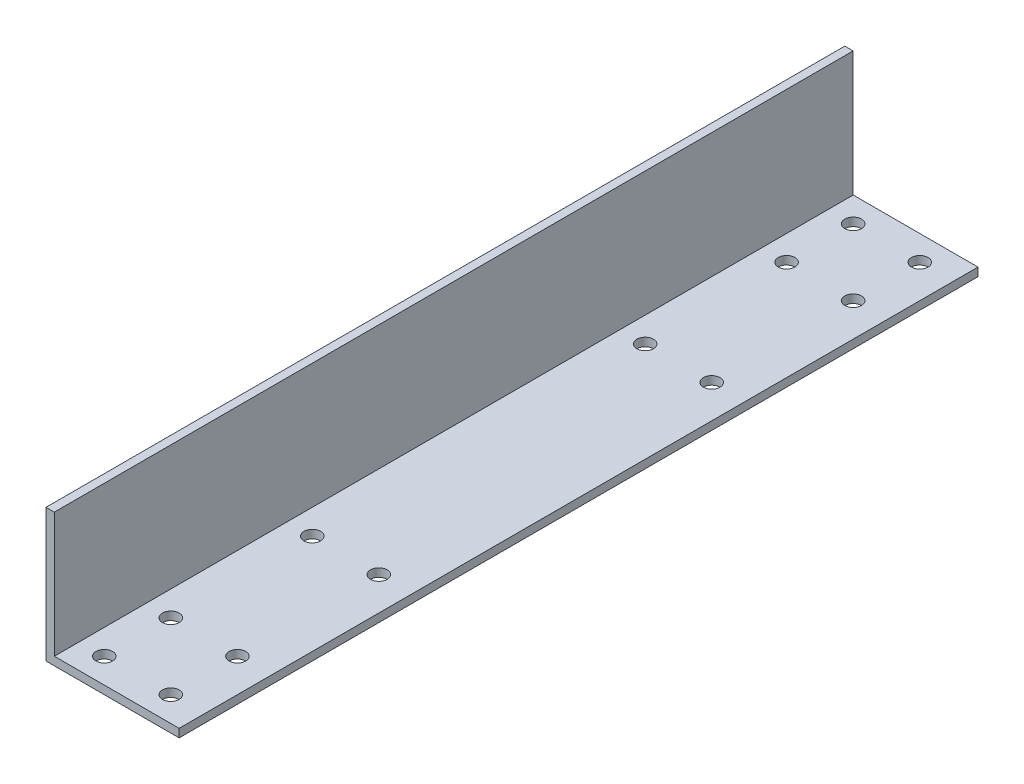
ISO-10303-21;
HEADER;
FILE_DESCRIPTION(('STEP AP214'),'2;1');
FILE_NAME('part.step','',(''),(''),'','','');
FILE_SCHEMA(('AUTOMOTIVE_DESIGN { 1 0 10303 214 1 1 1 1 }'));
ENDSEC;
DATA;
#1=APPLICATION_CONTEXT('core data for automotive mechanical design processes');
#2=APPLICATION_PROTOCOL_DEFINITION('international standard','automotive_design',2000,#1);
#3=PRODUCT_CONTEXT('',#1,'mechanical');
#4=PRODUCT('Part','Part','',(#3));
#5=PRODUCT_RELATED_PRODUCT_CATEGORY('part','',(#4));
#6=PRODUCT_DEFINITION_FORMATION('','',#4);
#7=PRODUCT_DEFINITION_CONTEXT('part definition',#1,'design');
#8=PRODUCT_DEFINITION('design','',#6,#7);
#9=PRODUCT_DEFINITION_SHAPE('','',#8);
#10=(LENGTH_UNIT() NAMED_UNIT(*) SI_UNIT(.MILLI.,.METRE.));
#11=(NAMED_UNIT(*) PLANE_ANGLE_UNIT() SI_UNIT($,.RADIAN.));
#12=(NAMED_UNIT(*) SI_UNIT($,.STERADIAN.) SOLID_ANGLE_UNIT());
#13=UNCERTAINTY_MEASURE_WITH_UNIT(LENGTH_MEASURE(1.E-05),#10,'distance_accuracy_value','');
#14=(GEOMETRIC_REPRESENTATION_CONTEXT(3) GLOBAL_UNCERTAINTY_ASSIGNED_CONTEXT((#13)) GLOBAL_UNIT_ASSIGNED_CONTEXT((#10,
#11,#12)) REPRESENTATION_CONTEXT('',''));
#15=CARTESIAN_POINT('',(0.,0.,0.));
#16=DIRECTION('',(0.,0.,1.));
#17=DIRECTION('',(1.,0.,0.));
#18=AXIS2_PLACEMENT_3D('',#15,#16,#17);
#19=CARTESIAN_POINT('',(0.,0.,304.8));
#20=DIRECTION('',(0.,1.,0.));
#21=DIRECTION('',(0.,0.,1.));
#22=AXIS2_PLACEMENT_3D('',#19,#20,#21);
#23=PLANE('',#22);
#24=CARTESIAN_POINT('',(12.7,0.,88.9));
#25=DIRECTION('',(0.,-1.,0.));
#26=DIRECTION('',(0.,0.,-1.));
#27=AXIS2_PLACEMENT_3D('',#24,#25,#26);
#28=CIRCLE('',#27,3.175);
#29=CARTESIAN_POINT('',(12.7,0.,85.725));
#30=VERTEX_POINT('',#29);
#31=EDGE_CURVE('E385',#30,#30,#28,.T.);
#32=ORIENTED_EDGE('',*,*,#31,.F.);
#33=EDGE_LOOP('',(#32));
#34=FACE_BOUND('',#33,.T.);
#35=CARTESIAN_POINT('',(12.7,0.,295.275));
#36=DIRECTION('',(0.,-1.,0.));
#37=DIRECTION('',(0.,0.,-1.));
#38=AXIS2_PLACEMENT_3D('',#35,#36,#37);
#39=CIRCLE('',#38,3.175);
#40=CARTESIAN_POINT('',(12.7,0.,292.1));
#41=VERTEX_POINT('',#40);
#42=EDGE_CURVE('E391',#41,#41,#39,.F.);
#43=ORIENTED_EDGE('',*,*,#42,.T.);
#44=EDGE_LOOP('',(#43));
#45=FACE_BOUND('',#44,.T.);
#46=CARTESIAN_POINT('',(12.7,0.,269.875));
#47=DIRECTION('',(0.,-1.,0.));
#48=DIRECTION('',(0.,0.,-1.));
#49=AXIS2_PLACEMENT_3D('',#46,#47,#48);
#50=CIRCLE('',#49,3.175);
#51=CARTESIAN_POINT('',(12.7,0.,266.7));
#52=VERTEX_POINT('',#51);
#53=EDGE_CURVE('E399',#52,#52,#50,.F.);
#54=ORIENTED_EDGE('',*,*,#53,.T.);
#55=EDGE_LOOP('',(#54));
#56=FACE_BOUND('',#55,.T.);
#57=CARTESIAN_POINT('',(38.1,0.,269.875));
#58=DIRECTION('',(0.,-1.,0.));
#59=DIRECTION('',(0.,0.,-1.));
#60=AXIS2_PLACEMENT_3D('',#57,#58,#59);
#61=CIRCLE('',#60,3.175);
#62=CARTESIAN_POINT('',(38.1,0.,266.7));
#63=VERTEX_POINT('',#62);
#64=EDGE_CURVE('E428',#63,#63,#61,.F.);
#65=ORIENTED_EDGE('',*,*,#64,.T.);
#66=EDGE_LOOP('',(#65));
#67=FACE_BOUND('',#66,.T.);
#68=CARTESIAN_POINT('',(38.1,0.,295.275));
#69=DIRECTION('',(0.,-1.,0.));
#70=DIRECTION('',(0.,0.,-1.));
#71=AXIS2_PLACEMENT_3D('',#68,#69,#70);
#72=CIRCLE('',#71,3.175);
#73=CARTESIAN_POINT('',(38.1,0.,292.1));
#74=VERTEX_POINT('',#73);
#75=EDGE_CURVE('E394',#74,#74,#72,.F.);
#76=ORIENTED_EDGE('',*,*,#75,.T.);
#77=EDGE_LOOP('',(#76));
#78=FACE_BOUND('',#77,.T.);
#79=CARTESIAN_POINT('',(38.1,0.,34.925));
#80=DIRECTION('',(0.,-1.,0.));
#81=DIRECTION('',(0.,0.,-1.));
#82=AXIS2_PLACEMENT_3D('',#79,#80,#81);
#83=CIRCLE('',#82,3.175);
#84=CARTESIAN_POINT('',(38.1,0.,31.75));
#85=VERTEX_POINT('',#84);
#86=EDGE_CURVE('E183',#85,#85,#83,.T.);
#87=ORIENTED_EDGE('',*,*,#86,.F.);
#88=EDGE_LOOP('',(#87));
#89=FACE_BOUND('',#88,.T.);
#90=DIRECTION('',(1.,0.,0.));
#91=VECTOR('',#90,1.);
#92=CARTESIAN_POINT('',(0.,0.,0.));
#93=LINE('',#92,#91);
#94=CARTESIAN_POINT('',(0.,0.,0.));
#95=VERTEX_POINT('',#94);
#96=CARTESIAN_POINT('',(50.8,0.,0.));
#97=VERTEX_POINT('',#96);
#98=EDGE_CURVE('E126',#95,#97,#93,.T.);
#99=ORIENTED_EDGE('',*,*,#98,.T.);
#100=DIRECTION('',(0.,0.,-1.));
#101=VECTOR('',#100,1.);
#102=CARTESIAN_POINT('',(50.8,0.,304.8));
#103=LINE('',#102,#101);
#104=CARTESIAN_POINT('',(50.8,0.,304.8));
#105=VERTEX_POINT('',#104);
#106=EDGE_CURVE('E45',#105,#97,#103,.T.);
#107=ORIENTED_EDGE('',*,*,#106,.F.);
#108=DIRECTION('',(1.,0.,0.));
#109=VECTOR('',#108,1.);
#110=CARTESIAN_POINT('',(0.,0.,304.8));
#111=LINE('',#110,#109);
#112=CARTESIAN_POINT('',(0.,0.,304.8));
#113=VERTEX_POINT('',#112);
#114=EDGE_CURVE('E91',#113,#105,#111,.T.);
#115=ORIENTED_EDGE('',*,*,#114,.F.);
#116=DIRECTION('',(0.,0.,-1.));
#117=VECTOR('',#116,1.);
#118=CARTESIAN_POINT('',(0.,0.,304.8));
#119=LINE('',#118,#117);
#120=EDGE_CURVE('E11',#113,#95,#119,.T.);
#121=ORIENTED_EDGE('',*,*,#120,.T.);
#122=EDGE_LOOP('',(#99,#107,#115,#121));
#123=FACE_BOUND('',#122,.T.);
#124=CARTESIAN_POINT('',(12.7,0.,9.525));
#125=DIRECTION('',(0.,-1.,0.));
#126=DIRECTION('',(0.,0.,-1.));
#127=AXIS2_PLACEMENT_3D('',#124,#125,#126);
#128=CIRCLE('',#127,3.175);
#129=CARTESIAN_POINT('',(12.7,0.,6.35));
#130=VERTEX_POINT('',#129);
#131=EDGE_CURVE('E142',#130,#130,#128,.T.);
#132=ORIENTED_EDGE('',*,*,#131,.F.);
#133=EDGE_LOOP('',(#132));
#134=FACE_BOUND('',#133,.T.);
#135=CARTESIAN_POINT('',(38.1,0.,215.9));
#136=DIRECTION('',(0.,-1.,0.));
#137=DIRECTION('',(0.,0.,-1.));
#138=AXIS2_PLACEMENT_3D('',#135,#136,#137);
#139=CIRCLE('',#138,3.175);
#140=CARTESIAN_POINT('',(38.1,0.,212.725));
#141=VERTEX_POINT('',#140);
#142=EDGE_CURVE('E384',#141,#141,#139,.F.);
#143=ORIENTED_EDGE('',*,*,#142,.T.);
#144=EDGE_LOOP('',(#143));
#145=FACE_BOUND('',#144,.T.);
#146=CARTESIAN_POINT('',(12.7,0.,215.9));
#147=DIRECTION('',(0.,-1.,0.));
#148=DIRECTION('',(0.,0.,-1.));
#149=AXIS2_PLACEMENT_3D('',#146,#147,#148);
#150=CIRCLE('',#149,3.175);
#151=CARTESIAN_POINT('',(12.7,0.,212.725));
#152=VERTEX_POINT('',#151);
#153=EDGE_CURVE('E388',#152,#152,#150,.F.);
#154=ORIENTED_EDGE('',*,*,#153,.T.);
#155=EDGE_LOOP('',(#154));
#156=FACE_BOUND('',#155,.T.);
#157=CARTESIAN_POINT('',(38.1,0.,9.525));
#158=DIRECTION('',(0.,-1.,0.));
#159=DIRECTION('',(0.,0.,-1.));
#160=AXIS2_PLACEMENT_3D('',#157,#158,#159);
#161=CIRCLE('',#160,3.175);
#162=CARTESIAN_POINT('',(38.1,0.,6.35000000000001));
#163=VERTEX_POINT('',#162);
#164=EDGE_CURVE('E400',#163,#163,#161,.T.);
#165=ORIENTED_EDGE('',*,*,#164,.F.);
#166=EDGE_LOOP('',(#165));
#167=FACE_BOUND('',#166,.T.);
#168=CARTESIAN_POINT('',(12.7,0.,34.925));
#169=DIRECTION('',(0.,-1.,0.));
#170=DIRECTION('',(0.,0.,-1.));
#171=AXIS2_PLACEMENT_3D('',#168,#169,#170);
#172=CIRCLE('',#171,3.175);
#173=CARTESIAN_POINT('',(12.7,0.,31.75));
#174=VERTEX_POINT('',#173);
#175=EDGE_CURVE('E147',#174,#174,#172,.T.);
#176=ORIENTED_EDGE('',*,*,#175,.F.);
#177=EDGE_LOOP('',(#176));
#178=FACE_BOUND('',#177,.T.);
#179=CARTESIAN_POINT('',(38.1,0.,88.9));
#180=DIRECTION('',(0.,-1.,0.));
#181=DIRECTION('',(0.,0.,-1.));
#182=AXIS2_PLACEMENT_3D('',#179,#180,#181);
#183=CIRCLE('',#182,3.175);
#184=CARTESIAN_POINT('',(38.1,0.,85.725));
#185=VERTEX_POINT('',#184);
#186=EDGE_CURVE('E382',#185,#185,#183,.T.);
#187=ORIENTED_EDGE('',*,*,#186,.F.);
#188=EDGE_LOOP('',(#187));
#189=FACE_BOUND('',#188,.T.);
#190=ADVANCED_FACE('F35',(#34,#45,#56,#67,#78,#89,#123,#134,#145,#156,#167,#178,#189),#23,.F.);
#191=CARTESIAN_POINT('',(50.8,3.175,304.8));
#192=DIRECTION('',(0.,-1.,0.));
#193=DIRECTION('',(1.,0.,0.));
#194=AXIS2_PLACEMENT_3D('',#191,#192,#193);
#195=PLANE('',#194);
#196=CARTESIAN_POINT('',(12.7,3.17499999999999,88.9));
#197=DIRECTION('',(0.,-1.,0.));
#198=DIRECTION('',(1.,0.,0.));
#199=AXIS2_PLACEMENT_3D('',#196,#197,#198);
#200=CIRCLE('',#199,3.175);
#201=CARTESIAN_POINT('',(15.875,3.17499999999999,88.9));
#202=VERTEX_POINT('',#201);
#203=EDGE_CURVE('E170',#202,#202,#200,.T.);
#204=ORIENTED_EDGE('',*,*,#203,.T.);
#205=EDGE_LOOP('',(#204));
#206=FACE_BOUND('',#205,.T.);
#207=CARTESIAN_POINT('',(12.7,3.17499999999999,295.275));
#208=DIRECTION('',(0.,-1.,0.));
#209=DIRECTION('',(1.,0.,0.));
#210=AXIS2_PLACEMENT_3D('',#207,#208,#209);
#211=CIRCLE('',#210,3.175);
#212=CARTESIAN_POINT('',(15.875,3.17499999999999,295.275));
#213=VERTEX_POINT('',#212);
#214=EDGE_CURVE('E168',#213,#213,#211,.F.);
#215=ORIENTED_EDGE('',*,*,#214,.F.);
#216=EDGE_LOOP('',(#215));
#217=FACE_BOUND('',#216,.T.);
#218=CARTESIAN_POINT('',(12.7,3.17499999999999,269.875));
#219=DIRECTION('',(0.,-1.,0.));
#220=DIRECTION('',(1.,0.,0.));
#221=AXIS2_PLACEMENT_3D('',#218,#219,#220);
#222=CIRCLE('',#221,3.175);
#223=CARTESIAN_POINT('',(15.875,3.17499999999999,269.875));
#224=VERTEX_POINT('',#223);
#225=EDGE_CURVE('E165',#224,#224,#222,.F.);
#226=ORIENTED_EDGE('',*,*,#225,.F.);
#227=EDGE_LOOP('',(#226));
#228=FACE_BOUND('',#227,.T.);
#229=CARTESIAN_POINT('',(38.1,3.175,269.875));
#230=DIRECTION('',(0.,-1.,0.));
#231=DIRECTION('',(1.,0.,0.));
#232=AXIS2_PLACEMENT_3D('',#229,#230,#231);
#233=CIRCLE('',#232,3.175);
#234=CARTESIAN_POINT('',(41.275,3.175,269.875));
#235=VERTEX_POINT('',#234);
#236=EDGE_CURVE('E162',#235,#235,#233,.F.);
#237=ORIENTED_EDGE('',*,*,#236,.F.);
#238=EDGE_LOOP('',(#237));
#239=FACE_BOUND('',#238,.T.);
#240=CARTESIAN_POINT('',(38.1,3.175,295.275));
#241=DIRECTION('',(0.,-1.,0.));
#242=DIRECTION('',(1.,0.,0.));
#243=AXIS2_PLACEMENT_3D('',#240,#241,#242);
#244=CIRCLE('',#243,3.175);
#245=CARTESIAN_POINT('',(41.275,3.175,295.275));
#246=VERTEX_POINT('',#245);
#247=EDGE_CURVE('E159',#246,#246,#244,.F.);
#248=ORIENTED_EDGE('',*,*,#247,.F.);
#249=EDGE_LOOP('',(#248));
#250=FACE_BOUND('',#249,.T.);
#251=CARTESIAN_POINT('',(38.1,3.175,34.925));
#252=DIRECTION('',(0.,-1.,0.));
#253=DIRECTION('',(1.,0.,0.));
#254=AXIS2_PLACEMENT_3D('',#251,#252,#253);
#255=CIRCLE('',#254,3.175);
#256=CARTESIAN_POINT('',(41.275,3.175,34.925));
#257=VERTEX_POINT('',#256);
#258=EDGE_CURVE('E153',#257,#257,#255,.T.);
#259=ORIENTED_EDGE('',*,*,#258,.T.);
#260=EDGE_LOOP('',(#259));
#261=FACE_BOUND('',#260,.T.);
#262=DIRECTION('',(-1.,0.,0.));
#263=VECTOR('',#262,1.);
#264=CARTESIAN_POINT('',(50.8,3.175,0.));
#265=LINE('',#264,#263);
#266=CARTESIAN_POINT('',(50.8,3.175,0.));
#267=VERTEX_POINT('',#266);
#268=CARTESIAN_POINT('',(3.175,3.17499999999999,0.));
#269=VERTEX_POINT('',#268);
#270=EDGE_CURVE('E113',#267,#269,#265,.T.);
#271=ORIENTED_EDGE('',*,*,#270,.T.);
#272=DIRECTION('',(0.,0.,-1.));
#273=VECTOR('',#272,1.);
#274=CARTESIAN_POINT('',(3.175,3.17499999999999,304.8));
#275=LINE('',#274,#273);
#276=CARTESIAN_POINT('',(3.175,3.17499999999999,304.8));
#277=VERTEX_POINT('',#276);
#278=EDGE_CURVE('E109',#277,#269,#275,.T.);
#279=ORIENTED_EDGE('',*,*,#278,.F.);
#280=DIRECTION('',(-1.,0.,0.));
#281=VECTOR('',#280,1.);
#282=CARTESIAN_POINT('',(50.8,3.175,304.8));
#283=LINE('',#282,#281);
#284=CARTESIAN_POINT('',(50.8,3.175,304.8));
#285=VERTEX_POINT('',#284);
#286=EDGE_CURVE('E98',#285,#277,#283,.T.);
#287=ORIENTED_EDGE('',*,*,#286,.F.);
#288=DIRECTION('',(0.,0.,-1.));
#289=VECTOR('',#288,1.);
#290=CARTESIAN_POINT('',(50.8,3.175,304.8));
#291=LINE('',#290,#289);
#292=EDGE_CURVE('E114',#285,#267,#291,.T.);
#293=ORIENTED_EDGE('',*,*,#292,.T.);
#294=EDGE_LOOP('',(#271,#279,#287,#293));
#295=FACE_BOUND('',#294,.T.);
#296=CARTESIAN_POINT('',(12.7,3.17499999999999,9.525));
#297=DIRECTION('',(0.,-1.,0.));
#298=DIRECTION('',(1.,0.,0.));
#299=AXIS2_PLACEMENT_3D('',#296,#297,#298);
#300=CIRCLE('',#299,3.175);
#301=CARTESIAN_POINT('',(15.875,3.17499999999999,9.525));
#302=VERTEX_POINT('',#301);
#303=EDGE_CURVE('E127',#302,#302,#300,.T.);
#304=ORIENTED_EDGE('',*,*,#303,.T.);
#305=EDGE_LOOP('',(#304));
#306=FACE_BOUND('',#305,.T.);
#307=CARTESIAN_POINT('',(38.1,3.175,215.9));
#308=DIRECTION('',(0.,-1.,0.));
#309=DIRECTION('',(1.,0.,0.));
#310=AXIS2_PLACEMENT_3D('',#307,#308,#309);
#311=CIRCLE('',#310,3.175);
#312=CARTESIAN_POINT('',(41.275,3.175,215.9));
#313=VERTEX_POINT('',#312);
#314=EDGE_CURVE('E143',#313,#313,#311,.F.);
#315=ORIENTED_EDGE('',*,*,#314,.F.);
#316=EDGE_LOOP('',(#315));
#317=FACE_BOUND('',#316,.T.);
#318=CARTESIAN_POINT('',(12.7,3.17499999999999,215.9));
#319=DIRECTION('',(0.,-1.,0.));
#320=DIRECTION('',(1.,0.,0.));
#321=AXIS2_PLACEMENT_3D('',#318,#319,#320);
#322=CIRCLE('',#321,3.175);
#323=CARTESIAN_POINT('',(15.875,3.17499999999999,215.9));
#324=VERTEX_POINT('',#323);
#325=EDGE_CURVE('E146',#324,#324,#322,.F.);
#326=ORIENTED_EDGE('',*,*,#325,.F.);
#327=EDGE_LOOP('',(#326));
#328=FACE_BOUND('',#327,.T.);
#329=CARTESIAN_POINT('',(38.1,3.175,9.525));
#330=DIRECTION('',(0.,-1.,0.));
#331=DIRECTION('',(1.,0.,0.));
#332=AXIS2_PLACEMENT_3D('',#329,#330,#331);
#333=CIRCLE('',#332,3.175);
#334=CARTESIAN_POINT('',(41.275,3.175,9.525));
#335=VERTEX_POINT('',#334);
#336=EDGE_CURVE('E150',#335,#335,#333,.T.);
#337=ORIENTED_EDGE('',*,*,#336,.T.);
#338=EDGE_LOOP('',(#337));
#339=FACE_BOUND('',#338,.T.);
#340=CARTESIAN_POINT('',(12.7,3.17499999999999,34.925));
#341=DIRECTION('',(0.,-1.,0.));
#342=DIRECTION('',(1.,0.,0.));
#343=AXIS2_PLACEMENT_3D('',#340,#341,#342);
#344=CIRCLE('',#343,3.175);
#345=CARTESIAN_POINT('',(15.875,3.17499999999999,34.925));
#346=VERTEX_POINT('',#345);
#347=EDGE_CURVE('E156',#346,#346,#344,.T.);
#348=ORIENTED_EDGE('',*,*,#347,.T.);
#349=EDGE_LOOP('',(#348));
#350=FACE_BOUND('',#349,.T.);
#351=CARTESIAN_POINT('',(38.1,3.175,88.9));
#352=DIRECTION('',(0.,-1.,0.));
#353=DIRECTION('',(1.,0.,0.));
#354=AXIS2_PLACEMENT_3D('',#351,#352,#353);
#355=CIRCLE('',#354,3.175);
#356=CARTESIAN_POINT('',(41.275,3.175,88.9));
#357=VERTEX_POINT('',#356);
#358=EDGE_CURVE('E39',#357,#357,#355,.T.);
#359=ORIENTED_EDGE('',*,*,#358,.T.);
#360=EDGE_LOOP('',(#359));
#361=FACE_BOUND('',#360,.T.);
#362=ADVANCED_FACE('F110',(#206,#217,#228,#239,#250,#261,#295,#306,#317,#328,#339,#350,#361),
#195,.F.);
#363=CARTESIAN_POINT('',(0.,50.8,304.8));
#364=DIRECTION('',(1.,0.,0.));
#365=DIRECTION('',(0.,0.,-1.));
#366=AXIS2_PLACEMENT_3D('',#363,#364,#365);
#367=PLANE('',#366);
#368=DIRECTION('',(0.,-1.,0.));
#369=VECTOR('',#368,1.);
#370=CARTESIAN_POINT('',(0.,50.8,0.));
#371=LINE('',#370,#369);
#372=CARTESIAN_POINT('',(0.,50.8,0.));
#373=VERTEX_POINT('',#372);
#374=EDGE_CURVE('E123',#373,#95,#371,.T.);
#375=ORIENTED_EDGE('',*,*,#374,.T.);
#376=ORIENTED_EDGE('',*,*,#120,.F.);
#377=DIRECTION('',(0.,-1.,0.));
#378=VECTOR('',#377,1.);
#379=CARTESIAN_POINT('',(0.,50.8,304.8));
#380=LINE('',#379,#378);
#381=CARTESIAN_POINT('',(0.,50.8,304.8));
#382=VERTEX_POINT('',#381);
#383=EDGE_CURVE('E134',#382,#113,#380,.T.);
#384=ORIENTED_EDGE('',*,*,#383,.F.);
#385=DIRECTION('',(0.,0.,-1.));
#386=VECTOR('',#385,1.);
#387=CARTESIAN_POINT('',(0.,50.8,304.8));
#388=LINE('',#387,#386);
#389=EDGE_CURVE('E119',#382,#373,#388,.T.);
#390=ORIENTED_EDGE('',*,*,#389,.T.);
#391=EDGE_LOOP('',(#375,#376,#384,#390));
#392=FACE_BOUND('',#391,.T.);
#393=ADVANCED_FACE('F37',(#392),#367,.F.);
#394=CARTESIAN_POINT('',(50.8,0.,304.8));
#395=DIRECTION('',(-1.,0.,0.));
#396=DIRECTION('',(0.,0.,1.));
#397=AXIS2_PLACEMENT_3D('',#394,#395,#396);
#398=PLANE('',#397);
#399=DIRECTION('',(0.,1.,0.));
#400=VECTOR('',#399,1.);
#401=CARTESIAN_POINT('',(50.8,0.,0.));
#402=LINE('',#401,#400);
#403=EDGE_CURVE('E129',#97,#267,#402,.T.);
#404=ORIENTED_EDGE('',*,*,#403,.T.);
#405=ORIENTED_EDGE('',*,*,#292,.F.);
#406=DIRECTION('',(0.,1.,0.));
#407=VECTOR('',#406,1.);
#408=CARTESIAN_POINT('',(50.8,0.,304.8));
#409=LINE('',#408,#407);
#410=EDGE_CURVE('E104',#105,#285,#409,.T.);
#411=ORIENTED_EDGE('',*,*,#410,.F.);
#412=ORIENTED_EDGE('',*,*,#106,.T.);
#413=EDGE_LOOP('',(#404,#405,#411,#412));
#414=FACE_BOUND('',#413,.T.);
#415=ADVANCED_FACE('F191',(#414),#398,.F.);
#416=CARTESIAN_POINT('',(3.175,3.17499999999999,304.8));
#417=DIRECTION('',(-1.,0.,0.));
#418=DIRECTION('',(0.,-1.,0.));
#419=AXIS2_PLACEMENT_3D('',#416,#417,#418);
#420=PLANE('',#419);
#421=DIRECTION('',(0.,1.,0.));
#422=VECTOR('',#421,1.);
#423=CARTESIAN_POINT('',(3.175,3.17499999999999,0.));
#424=LINE('',#423,#422);
#425=CARTESIAN_POINT('',(3.175,50.8,0.));
#426=VERTEX_POINT('',#425);
#427=EDGE_CURVE('E77',#269,#426,#424,.T.);
#428=ORIENTED_EDGE('',*,*,#427,.T.);
#429=DIRECTION('',(0.,0.,-1.));
#430=VECTOR('',#429,1.);
#431=CARTESIAN_POINT('',(3.175,50.8,304.8));
#432=LINE('',#431,#430);
#433=CARTESIAN_POINT('',(3.175,50.8,304.8));
#434=VERTEX_POINT('',#433);
#435=EDGE_CURVE('E115',#434,#426,#432,.T.);
#436=ORIENTED_EDGE('',*,*,#435,.F.);
#437=DIRECTION('',(0.,1.,0.));
#438=VECTOR('',#437,1.);
#439=CARTESIAN_POINT('',(3.175,3.17499999999999,304.8));
#440=LINE('',#439,#438);
#441=EDGE_CURVE('E102',#277,#434,#440,.T.);
#442=ORIENTED_EDGE('',*,*,#441,.F.);
#443=ORIENTED_EDGE('',*,*,#278,.T.);
#444=EDGE_LOOP('',(#428,#436,#442,#443));
#445=FACE_BOUND('',#444,.T.);
#446=ADVANCED_FACE('F117',(#445),#420,.F.);
#447=CARTESIAN_POINT('',(3.175,50.8,304.8));
#448=DIRECTION('',(0.,-1.,0.));
#449=DIRECTION('',(0.,0.,-1.));
#450=AXIS2_PLACEMENT_3D('',#447,#448,#449);
#451=PLANE('',#450);
#452=DIRECTION('',(-1.,0.,0.));
#453=VECTOR('',#452,1.);
#454=CARTESIAN_POINT('',(3.175,50.8,0.));
#455=LINE('',#454,#453);
#456=EDGE_CURVE('E83',#426,#373,#455,.T.);
#457=ORIENTED_EDGE('',*,*,#456,.T.);
#458=ORIENTED_EDGE('',*,*,#389,.F.);
#459=DIRECTION('',(-1.,0.,0.));
#460=VECTOR('',#459,1.);
#461=CARTESIAN_POINT('',(3.175,50.8,304.8));
#462=LINE('',#461,#460);
#463=EDGE_CURVE('E54',#434,#382,#462,.T.);
#464=ORIENTED_EDGE('',*,*,#463,.F.);
#465=ORIENTED_EDGE('',*,*,#435,.T.);
#466=EDGE_LOOP('',(#457,#458,#464,#465));
#467=FACE_BOUND('',#466,.T.);
#468=ADVANCED_FACE('F196',(#467),#451,.F.);
#469=CARTESIAN_POINT('',(0.,0.,304.8));
#470=DIRECTION('',(0.,0.,1.));
#471=DIRECTION('',(1.,0.,0.));
#472=AXIS2_PLACEMENT_3D('',#469,#470,#471);
#473=PLANE('',#472);
#474=ORIENTED_EDGE('',*,*,#383,.T.);
#475=ORIENTED_EDGE('',*,*,#114,.T.);
#476=ORIENTED_EDGE('',*,*,#410,.T.);
#477=ORIENTED_EDGE('',*,*,#286,.T.);
#478=ORIENTED_EDGE('',*,*,#441,.T.);
#479=ORIENTED_EDGE('',*,*,#463,.T.);
#480=EDGE_LOOP('',(#474,#475,#476,#477,#478,#479));
#481=FACE_BOUND('',#480,.T.);
#482=ADVANCED_FACE('F100',(#481),#473,.T.);
#483=CARTESIAN_POINT('',(0.,0.,0.));
#484=DIRECTION('',(0.,0.,1.));
#485=DIRECTION('',(1.,0.,0.));
#486=AXIS2_PLACEMENT_3D('',#483,#484,#485);
#487=PLANE('',#486);
#488=ORIENTED_EDGE('',*,*,#374,.F.);
#489=ORIENTED_EDGE('',*,*,#456,.F.);
#490=ORIENTED_EDGE('',*,*,#427,.F.);
#491=ORIENTED_EDGE('',*,*,#270,.F.);
#492=ORIENTED_EDGE('',*,*,#403,.F.);
#493=ORIENTED_EDGE('',*,*,#98,.F.);
#494=EDGE_LOOP('',(#488,#489,#490,#491,#492,#493));
#495=FACE_BOUND('',#494,.T.);
#496=ADVANCED_FACE('F194',(#495),#487,.F.);
#497=CARTESIAN_POINT('',(12.7,50.8,9.525));
#498=DIRECTION('',(0.,-1.,0.));
#499=DIRECTION('',(0.,0.,-1.));
#500=AXIS2_PLACEMENT_3D('',#497,#498,#499);
#501=CYLINDRICAL_SURFACE('',#500,3.175);
#502=ORIENTED_EDGE('',*,*,#131,.T.);
#503=EDGE_LOOP('',(#502));
#504=FACE_BOUND('',#503,.T.);
#505=ORIENTED_EDGE('',*,*,#303,.F.);
#506=EDGE_LOOP('',(#505));
#507=FACE_BOUND('',#506,.T.);
#508=ADVANCED_FACE('F234',(#504,#507),#501,.F.);
#509=CARTESIAN_POINT('',(38.1,50.8,215.9));
#510=DIRECTION('',(0.,-1.,0.));
#511=DIRECTION('',(0.,0.,-1.));
#512=AXIS2_PLACEMENT_3D('',#509,#510,#511);
#513=CYLINDRICAL_SURFACE('',#512,3.175);
#514=ORIENTED_EDGE('',*,*,#142,.F.);
#515=EDGE_LOOP('',(#514));
#516=FACE_BOUND('',#515,.T.);
#517=ORIENTED_EDGE('',*,*,#314,.T.);
#518=EDGE_LOOP('',(#517));
#519=FACE_BOUND('',#518,.T.);
#520=ADVANCED_FACE('F239',(#516,#519),#513,.F.);
#521=CARTESIAN_POINT('',(12.7,50.8,215.9));
#522=DIRECTION('',(0.,-1.,0.));
#523=DIRECTION('',(0.,0.,-1.));
#524=AXIS2_PLACEMENT_3D('',#521,#522,#523);
#525=CYLINDRICAL_SURFACE('',#524,3.175);
#526=ORIENTED_EDGE('',*,*,#153,.F.);
#527=EDGE_LOOP('',(#526));
#528=FACE_BOUND('',#527,.T.);
#529=ORIENTED_EDGE('',*,*,#325,.T.);
#530=EDGE_LOOP('',(#529));
#531=FACE_BOUND('',#530,.T.);
#532=ADVANCED_FACE('F249',(#528,#531),#525,.F.);
#533=CARTESIAN_POINT('',(38.1,50.8,9.525));
#534=DIRECTION('',(0.,-1.,0.));
#535=DIRECTION('',(0.,0.,-1.));
#536=AXIS2_PLACEMENT_3D('',#533,#534,#535);
#537=CYLINDRICAL_SURFACE('',#536,3.175);
#538=ORIENTED_EDGE('',*,*,#164,.T.);
#539=EDGE_LOOP('',(#538));
#540=FACE_BOUND('',#539,.T.);
#541=ORIENTED_EDGE('',*,*,#336,.F.);
#542=EDGE_LOOP('',(#541));
#543=FACE_BOUND('',#542,.T.);
#544=ADVANCED_FACE('F259',(#540,#543),#537,.F.);
#545=CARTESIAN_POINT('',(38.1,50.8,34.925));
#546=DIRECTION('',(0.,-1.,0.));
#547=DIRECTION('',(0.,0.,-1.));
#548=AXIS2_PLACEMENT_3D('',#545,#546,#547);
#549=CYLINDRICAL_SURFACE('',#548,3.175);
#550=ORIENTED_EDGE('',*,*,#86,.T.);
#551=EDGE_LOOP('',(#550));
#552=FACE_BOUND('',#551,.T.);
#553=ORIENTED_EDGE('',*,*,#258,.F.);
#554=EDGE_LOOP('',(#553));
#555=FACE_BOUND('',#554,.T.);
#556=ADVANCED_FACE('F269',(#552,#555),#549,.F.);
#557=CARTESIAN_POINT('',(12.7,50.8,34.925));
#558=DIRECTION('',(0.,-1.,0.));
#559=DIRECTION('',(0.,0.,-1.));
#560=AXIS2_PLACEMENT_3D('',#557,#558,#559);
#561=CYLINDRICAL_SURFACE('',#560,3.175);
#562=ORIENTED_EDGE('',*,*,#175,.T.);
#563=EDGE_LOOP('',(#562));
#564=FACE_BOUND('',#563,.T.);
#565=ORIENTED_EDGE('',*,*,#347,.F.);
#566=EDGE_LOOP('',(#565));
#567=FACE_BOUND('',#566,.T.);
#568=ADVANCED_FACE('F279',(#564,#567),#561,.F.);
#569=CARTESIAN_POINT('',(38.1,50.8,295.275));
#570=DIRECTION('',(0.,-1.,0.));
#571=DIRECTION('',(0.,0.,-1.));
#572=AXIS2_PLACEMENT_3D('',#569,#570,#571);
#573=CYLINDRICAL_SURFACE('',#572,3.175);
#574=ORIENTED_EDGE('',*,*,#75,.F.);
#575=EDGE_LOOP('',(#574));
#576=FACE_BOUND('',#575,.T.);
#577=ORIENTED_EDGE('',*,*,#247,.T.);
#578=EDGE_LOOP('',(#577));
#579=FACE_BOUND('',#578,.T.);
#580=ADVANCED_FACE('F289',(#576,#579),#573,.F.);
#581=CARTESIAN_POINT('',(38.1,50.8,269.875));
#582=DIRECTION('',(0.,-1.,0.));
#583=DIRECTION('',(0.,0.,-1.));
#584=AXIS2_PLACEMENT_3D('',#581,#582,#583);
#585=CYLINDRICAL_SURFACE('',#584,3.175);
#586=ORIENTED_EDGE('',*,*,#64,.F.);
#587=EDGE_LOOP('',(#586));
#588=FACE_BOUND('',#587,.T.);
#589=ORIENTED_EDGE('',*,*,#236,.T.);
#590=EDGE_LOOP('',(#589));
#591=FACE_BOUND('',#590,.T.);
#592=ADVANCED_FACE('F299',(#588,#591),#585,.F.);
#593=CARTESIAN_POINT('',(12.7,50.8,269.875));
#594=DIRECTION('',(0.,-1.,0.));
#595=DIRECTION('',(0.,0.,-1.));
#596=AXIS2_PLACEMENT_3D('',#593,#594,#595);
#597=CYLINDRICAL_SURFACE('',#596,3.175);
#598=ORIENTED_EDGE('',*,*,#53,.F.);
#599=EDGE_LOOP('',(#598));
#600=FACE_BOUND('',#599,.T.);
#601=ORIENTED_EDGE('',*,*,#225,.T.);
#602=EDGE_LOOP('',(#601));
#603=FACE_BOUND('',#602,.T.);
#604=ADVANCED_FACE('F309',(#600,#603),#597,.F.);
#605=CARTESIAN_POINT('',(12.7,50.8,295.275));
#606=DIRECTION('',(0.,-1.,0.));
#607=DIRECTION('',(0.,0.,-1.));
#608=AXIS2_PLACEMENT_3D('',#605,#606,#607);
#609=CYLINDRICAL_SURFACE('',#608,3.175);
#610=ORIENTED_EDGE('',*,*,#42,.F.);
#611=EDGE_LOOP('',(#610));
#612=FACE_BOUND('',#611,.T.);
#613=ORIENTED_EDGE('',*,*,#214,.T.);
#614=EDGE_LOOP('',(#613));
#615=FACE_BOUND('',#614,.T.);
#616=ADVANCED_FACE('F319',(#612,#615),#609,.F.);
#617=CARTESIAN_POINT('',(12.7,50.8,88.9));
#618=DIRECTION('',(0.,-1.,0.));
#619=DIRECTION('',(0.,0.,-1.));
#620=AXIS2_PLACEMENT_3D('',#617,#618,#619);
#621=CYLINDRICAL_SURFACE('',#620,3.175);
#622=ORIENTED_EDGE('',*,*,#31,.T.);
#623=EDGE_LOOP('',(#622));
#624=FACE_BOUND('',#623,.T.);
#625=ORIENTED_EDGE('',*,*,#203,.F.);
#626=EDGE_LOOP('',(#625));
#627=FACE_BOUND('',#626,.T.);
#628=ADVANCED_FACE('F329',(#624,#627),#621,.F.);
#629=CARTESIAN_POINT('',(38.1,50.8,88.9));
#630=DIRECTION('',(0.,-1.,0.));
#631=DIRECTION('',(0.,0.,-1.));
#632=AXIS2_PLACEMENT_3D('',#629,#630,#631);
#633=CYLINDRICAL_SURFACE('',#632,3.175);
#634=ORIENTED_EDGE('',*,*,#186,.T.);
#635=EDGE_LOOP('',(#634));
#636=FACE_BOUND('',#635,.T.);
#637=ORIENTED_EDGE('',*,*,#358,.F.);
#638=EDGE_LOOP('',(#637));
#639=FACE_BOUND('',#638,.T.);
#640=ADVANCED_FACE('F339',(#636,#639),#633,.F.);
#641=CLOSED_SHELL('',(#190,#362,#393,#415,#446,#468,#482,#496,#508,#520,#532,#544,#556,#568,
#580,#592,#604,#616,#628,#640));
#642=MANIFOLD_SOLID_BREP('B2',#641);
#643=ADVANCED_BREP_SHAPE_REPRESENTATION('',(#18,#642),#14);
#644=SHAPE_DEFINITION_REPRESENTATION(#9,#643);
ENDSEC;
END-ISO-10303-21;
